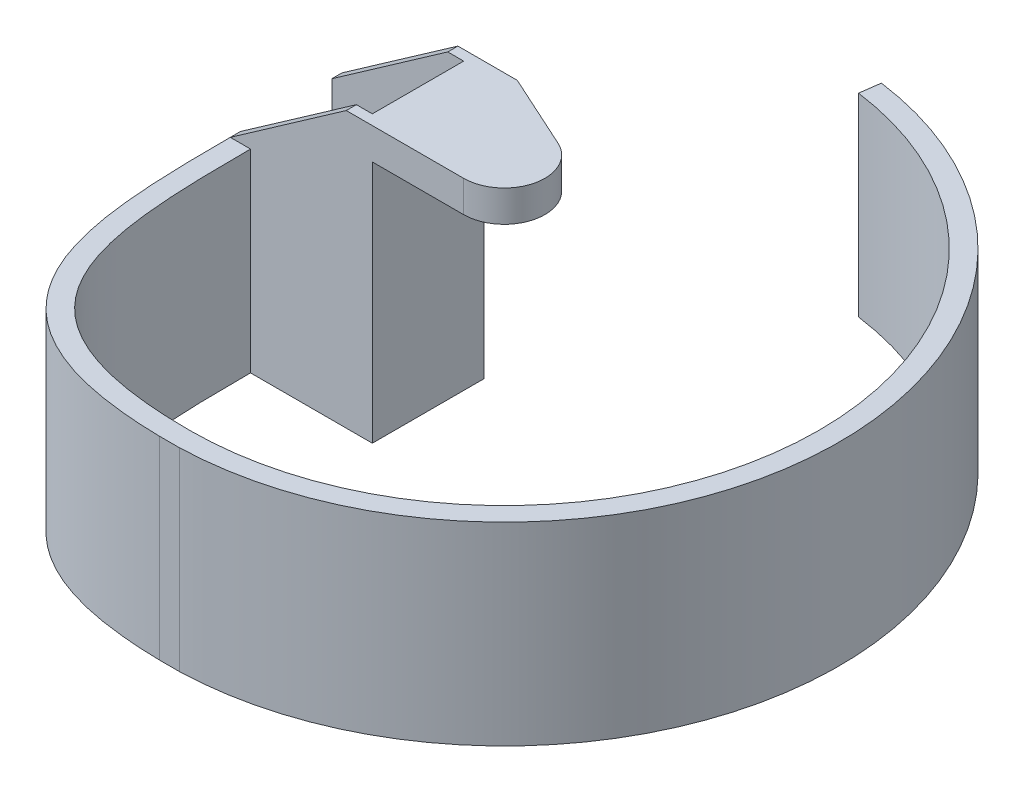
ISO-10303-21;
HEADER;
FILE_DESCRIPTION(('STEP AP214'),'2;1');
FILE_NAME('part.step','',(''),(''),'','','');
FILE_SCHEMA(('AUTOMOTIVE_DESIGN { 1 0 10303 214 1 1 1 1 }'));
ENDSEC;
DATA;
#1=APPLICATION_CONTEXT('core data for automotive mechanical design processes');
#2=APPLICATION_PROTOCOL_DEFINITION('international standard','automotive_design',2000,#1);
#3=PRODUCT_CONTEXT('',#1,'mechanical');
#4=PRODUCT('Part','Part','',(#3));
#5=PRODUCT_RELATED_PRODUCT_CATEGORY('part','',(#4));
#6=PRODUCT_DEFINITION_FORMATION('','',#4);
#7=PRODUCT_DEFINITION_CONTEXT('part definition',#1,'design');
#8=PRODUCT_DEFINITION('design','',#6,#7);
#9=PRODUCT_DEFINITION_SHAPE('','',#8);
#10=(LENGTH_UNIT() NAMED_UNIT(*) SI_UNIT(.MILLI.,.METRE.));
#11=(NAMED_UNIT(*) PLANE_ANGLE_UNIT() SI_UNIT($,.RADIAN.));
#12=(NAMED_UNIT(*) SI_UNIT($,.STERADIAN.) SOLID_ANGLE_UNIT());
#13=UNCERTAINTY_MEASURE_WITH_UNIT(LENGTH_MEASURE(1.E-05),#10,'distance_accuracy_value','');
#14=(GEOMETRIC_REPRESENTATION_CONTEXT(3) GLOBAL_UNCERTAINTY_ASSIGNED_CONTEXT((#13)) GLOBAL_UNIT_ASSIGNED_CONTEXT((#10,
#11,#12)) REPRESENTATION_CONTEXT('',''));
#15=CARTESIAN_POINT('',(0.,0.,0.));
#16=DIRECTION('',(0.,0.,1.));
#17=DIRECTION('',(1.,0.,0.));
#18=AXIS2_PLACEMENT_3D('',#15,#16,#17);
#19=CARTESIAN_POINT('',(-133.35,121.285,25.4));
#20=CARTESIAN_POINT('',(-133.35,121.285,131.233333333333));
#21=CARTESIAN_POINT('',(-127.000000000004,121.285,196.85));
#22=CARTESIAN_POINT('',(0.,121.285,196.85));
#23=B_SPLINE_CURVE_WITH_KNOTS('',3,(#19,#20,#21,#22),.UNSPECIFIED.,.F.,.F.,(4,4),(0.,1.),.UNSPECIFIED.);
#24=DIRECTION('',(0.,-1.,0.));
#25=VECTOR('',#24,1.);
#26=SURFACE_OF_LINEAR_EXTRUSION('',#23,#25);
#27=CARTESIAN_POINT('',(-133.35,0.,25.4));
#28=CARTESIAN_POINT('',(-133.35,0.,131.233333333333));
#29=CARTESIAN_POINT('',(-127.000000000004,0.,196.85));
#30=CARTESIAN_POINT('',(0.,0.,196.85));
#31=B_SPLINE_CURVE_WITH_KNOTS('',3,(#27,#28,#29,#30),.UNSPECIFIED.,.F.,.F.,(4,4),(0.,1.),.UNSPECIFIED.);
#32=CARTESIAN_POINT('',(-133.35,0.,25.4));
#33=VERTEX_POINT('',#32);
#34=CARTESIAN_POINT('',(0.,0.,196.85));
#35=VERTEX_POINT('',#34);
#36=EDGE_CURVE('E314',#33,#35,#31,.T.);
#37=ORIENTED_EDGE('',*,*,#36,.F.);
#38=DIRECTION('',(0.,-1.,0.));
#39=VECTOR('',#38,1.);
#40=CARTESIAN_POINT('',(-133.35,121.285,25.4));
#41=LINE('',#40,#39);
#42=CARTESIAN_POINT('',(-133.35,121.285,25.4));
#43=VERTEX_POINT('',#42);
#44=EDGE_CURVE('E52',#43,#33,#41,.T.);
#45=ORIENTED_EDGE('',*,*,#44,.F.);
#46=CARTESIAN_POINT('',(0.,121.285,196.85));
#47=VERTEX_POINT('',#46);
#48=EDGE_CURVE('E198',#43,#47,#23,.T.);
#49=ORIENTED_EDGE('',*,*,#48,.T.);
#50=DIRECTION('',(0.,-1.,0.));
#51=VECTOR('',#50,1.);
#52=CARTESIAN_POINT('',(0.,121.285,196.85));
#53=LINE('',#52,#51);
#54=EDGE_CURVE('E316',#47,#35,#53,.T.);
#55=ORIENTED_EDGE('',*,*,#54,.T.);
#56=EDGE_LOOP('',(#37,#45,#49,#55));
#57=FACE_BOUND('',#56,.T.);
#58=ADVANCED_FACE('F43',(#57),#26,.T.);
#59=CARTESIAN_POINT('',(-146.008404278864,121.285,12.741595721136));
#60=CARTESIAN_POINT('',(-146.008404278864,121.285,14.4342364692206));
#61=CARTESIAN_POINT('',(-146.008336547477,121.285,17.8077717619581));
#62=CARTESIAN_POINT('',(-146.008564139383,121.285,21.6027773371863));
#63=CARTESIAN_POINT('',(-146.008293238688,121.285,24.5474315018755));
#64=CARTESIAN_POINT('',(-146.008883870611,121.285,27.9687436822124));
#65=CARTESIAN_POINT('',(-145.992828985907,121.285,37.6758120791757));
#66=CARTESIAN_POINT('',(-145.847861716869,121.285,52.8132306916872));
#67=CARTESIAN_POINT('',(-145.252148771485,121.285,71.5712819286864));
#68=CARTESIAN_POINT('',(-144.048815033332,121.285,89.4193686386773));
#69=CARTESIAN_POINT('',(-142.031880926839,121.285,106.362231784065));
#70=CARTESIAN_POINT('',(-137.954990072308,121.285,127.728726744472));
#71=CARTESIAN_POINT('',(-131.289734266183,121.285,147.262243010393));
#72=CARTESIAN_POINT('',(-120.92863620716,121.285,164.576629863361));
#73=CARTESIAN_POINT('',(-111.101066217975,121.285,176.207339111434));
#74=CARTESIAN_POINT('',(-99.1375575259071,121.285,186.230706710612));
#75=CARTESIAN_POINT('',(-85.0632306803264,121.285,194.472251254184));
#76=CARTESIAN_POINT('',(-71.5910923653762,121.285,199.823977741644));
#77=CARTESIAN_POINT('',(-59.7326179444139,121.285,203.218129467848));
#78=CARTESIAN_POINT('',(-50.280608969257,121.285,205.327908470272));
#79=CARTESIAN_POINT('',(-40.2500714462276,121.285,207.008611147021));
#80=CARTESIAN_POINT('',(-31.3896524594036,121.285,208.056286946028));
#81=CARTESIAN_POINT('',(-23.9871472034043,121.285,208.684629614168));
#82=CARTESIAN_POINT('',(-18.2760240559845,121.285,209.051283620528));
#83=CARTESIAN_POINT('',(-13.3773718949414,121.285,209.269931642801));
#84=CARTESIAN_POINT('',(-9.38192810204939,121.285,209.392630986676));
#85=CARTESIAN_POINT('',(-7.34346977478592,121.285,209.436839099715));
#86=CARTESIAN_POINT('',(-6.32920213943207,121.285,209.454395275626));
#87=B_SPLINE_CURVE_WITH_KNOTS('',3,(#59,#60,#61,#62,#63,#64,#65,#66,#67,#68,#69,#70,#71,#72,#73,
#74,#75,#76,#77,#78,#79,#80,#81,#82,#83,#84,#85,#86),.UNSPECIFIED.,.F.,.F.,(4,1,1,1,1,1,1,1,1,1,
1,1,1,1,1,1,1,1,1,1,1,1,1,1,1,4),(-0.0398689898546898,-0.023875533967276,-0.0079967279437069,
-0.00399836397185345,0.00399836397185345,0.0241048336949654,0.0880786572446206,
0.152052480794276,0.216026304343931,0.280000127893586,0.343973951443241,0.471921598542552,
0.535895422092207,0.599869245641862,0.663843069191517,0.727816892741173,0.791790716290828,
0.823777628065655,0.855764539840483,0.887751451615311,0.919738363390138,0.935731819277552,
0.951725275164966,0.96771873105238,0.975715458996087,0.983712186939793),.UNSPECIFIED.);
#88=DIRECTION('',(0.,-1.,0.));
#89=VECTOR('',#88,1.);
#90=SURFACE_OF_LINEAR_EXTRUSION('',#87,#89);
#91=CARTESIAN_POINT('',(-146.008404278864,0.,12.741595721136));
#92=CARTESIAN_POINT('',(-146.008404278864,0.,14.4342364692206));
#93=CARTESIAN_POINT('',(-146.008336547477,0.,17.8077717619581));
#94=CARTESIAN_POINT('',(-146.008564139383,0.,21.6027773371863));
#95=CARTESIAN_POINT('',(-146.008293238688,0.,24.5474315018755));
#96=CARTESIAN_POINT('',(-146.008883870611,0.,27.9687436822124));
#97=CARTESIAN_POINT('',(-145.992828985907,0.,37.6758120791757));
#98=CARTESIAN_POINT('',(-145.847861716869,0.,52.8132306916872));
#99=CARTESIAN_POINT('',(-145.252148771485,0.,71.5712819286864));
#100=CARTESIAN_POINT('',(-144.048815033332,0.,89.4193686386773));
#101=CARTESIAN_POINT('',(-142.031880926839,0.,106.362231784065));
#102=CARTESIAN_POINT('',(-137.954990072308,0.,127.728726744472));
#103=CARTESIAN_POINT('',(-131.289734266183,0.,147.262243010393));
#104=CARTESIAN_POINT('',(-120.92863620716,0.,164.576629863361));
#105=CARTESIAN_POINT('',(-111.101066217975,0.,176.207339111434));
#106=CARTESIAN_POINT('',(-99.1375575259071,0.,186.230706710612));
#107=CARTESIAN_POINT('',(-85.0632306803264,0.,194.472251254184));
#108=CARTESIAN_POINT('',(-71.5910923653762,0.,199.823977741644));
#109=CARTESIAN_POINT('',(-59.7326179444139,0.,203.218129467848));
#110=CARTESIAN_POINT('',(-50.280608969257,0.,205.327908470272));
#111=CARTESIAN_POINT('',(-40.2500714462276,0.,207.008611147021));
#112=CARTESIAN_POINT('',(-31.3896524594036,0.,208.056286946028));
#113=CARTESIAN_POINT('',(-23.9871472034043,0.,208.684629614168));
#114=CARTESIAN_POINT('',(-18.2760240559845,0.,209.051283620528));
#115=CARTESIAN_POINT('',(-13.3773718949414,0.,209.269931642801));
#116=CARTESIAN_POINT('',(-9.38192810204939,0.,209.392630986676));
#117=CARTESIAN_POINT('',(-7.34346977478592,0.,209.436839099715));
#118=CARTESIAN_POINT('',(-6.32920213943207,0.,209.454395275626));
#119=B_SPLINE_CURVE_WITH_KNOTS('',3,(#91,#92,#93,#94,#95,#96,#97,#98,#99,#100,#101,#102,#103,
#104,#105,#106,#107,#108,#109,#110,#111,#112,#113,#114,#115,#116,#117,#118),.UNSPECIFIED.,.F.,
.F.,(4,1,1,1,1,1,1,1,1,1,1,1,1,1,1,1,1,1,1,1,1,1,1,1,1,4),(-0.0398689898546898,
-0.023875533967276,-0.0079967279437069,-0.00399836397185345,0.00399836397185345,
0.0241048336949654,0.0880786572446206,0.152052480794276,0.216026304343931,0.280000127893586,
0.343973951443241,0.471921598542552,0.535895422092207,0.599869245641862,0.663843069191517,
0.727816892741173,0.791790716290828,0.823777628065655,0.855764539840483,0.887751451615311,
0.919738363390138,0.935731819277552,0.951725275164966,0.96771873105238,0.975715458996087,
0.983712186939793),.UNSPECIFIED.);
#120=CARTESIAN_POINT('',(-146.008404278864,0.,25.4));
#121=VERTEX_POINT('',#120);
#122=CARTESIAN_POINT('',(-6.32920213943279,0.,209.454395275626));
#123=VERTEX_POINT('',#122);
#124=EDGE_CURVE('E319',#121,#123,#119,.T.);
#125=ORIENTED_EDGE('',*,*,#124,.T.);
#126=DIRECTION('',(0.,-1.,0.));
#127=VECTOR('',#126,1.);
#128=CARTESIAN_POINT('',(-6.32920213943279,121.285,209.454395275626));
#129=LINE('',#128,#127);
#130=CARTESIAN_POINT('',(-6.32920213943279,121.285,209.454395275626));
#131=VERTEX_POINT('',#130);
#132=EDGE_CURVE('E206',#131,#123,#129,.T.);
#133=ORIENTED_EDGE('',*,*,#132,.F.);
#134=CARTESIAN_POINT('',(-146.008404278864,121.285,25.4));
#135=VERTEX_POINT('',#134);
#136=EDGE_CURVE('E195',#135,#131,#87,.T.);
#137=ORIENTED_EDGE('',*,*,#136,.F.);
#138=DIRECTION('',(0.,-1.,0.));
#139=VECTOR('',#138,1.);
#140=CARTESIAN_POINT('',(-146.008404278864,121.285,25.4));
#141=LINE('',#140,#139);
#142=EDGE_CURVE('E203',#135,#121,#141,.T.);
#143=ORIENTED_EDGE('',*,*,#142,.T.);
#144=EDGE_LOOP('',(#125,#133,#137,#143));
#145=FACE_BOUND('',#144,.T.);
#146=ADVANCED_FACE('F202',(#145),#90,.F.);
#147=CARTESIAN_POINT('',(9.18524511941114E-13,121.285,209.454395275626));
#148=DIRECTION('',(0.,0.,-1.));
#149=DIRECTION('',(-1.,0.,0.));
#150=AXIS2_PLACEMENT_3D('',#147,#148,#149);
#151=PLANE('',#150);
#152=DIRECTION('',(1.,0.,0.));
#153=VECTOR('',#152,1.);
#154=CARTESIAN_POINT('',(9.18524511941114E-13,0.,209.454395275626));
#155=LINE('',#154,#153);
#156=CARTESIAN_POINT('',(6.32920213943129,0.,209.454395275626));
#157=VERTEX_POINT('',#156);
#158=EDGE_CURVE('E362',#123,#157,#155,.T.);
#159=ORIENTED_EDGE('',*,*,#158,.T.);
#160=DIRECTION('',(0.,-1.,0.));
#161=VECTOR('',#160,1.);
#162=CARTESIAN_POINT('',(6.32920213943129,121.285,209.454395275626));
#163=LINE('',#162,#161);
#164=CARTESIAN_POINT('',(6.32920213943129,121.285,209.454395275626));
#165=VERTEX_POINT('',#164);
#166=EDGE_CURVE('E215',#165,#157,#163,.T.);
#167=ORIENTED_EDGE('',*,*,#166,.F.);
#168=DIRECTION('',(1.,0.,0.));
#169=VECTOR('',#168,1.);
#170=CARTESIAN_POINT('',(9.18524511941114E-13,121.285,209.454395275626));
#171=LINE('',#170,#169);
#172=EDGE_CURVE('E208',#131,#165,#171,.T.);
#173=ORIENTED_EDGE('',*,*,#172,.F.);
#174=ORIENTED_EDGE('',*,*,#132,.T.);
#175=EDGE_LOOP('',(#159,#167,#173,#174));
#176=FACE_BOUND('',#175,.T.);
#177=ADVANCED_FACE('F237',(#176),#151,.F.);
#178=CARTESIAN_POINT('',(0.,121.285,0.));
#179=DIRECTION('',(0.,-1.,0.));
#180=DIRECTION('',(0.,0.,-1.));
#181=AXIS2_PLACEMENT_3D('',#178,#179,#180);
#182=CYLINDRICAL_SURFACE('',#181,209.55);
#183=CARTESIAN_POINT('',(0.,0.,0.));
#184=DIRECTION('',(0.,1.,0.));
#185=DIRECTION('',(0.,0.,1.));
#186=AXIS2_PLACEMENT_3D('',#183,#184,#185);
#187=CIRCLE('',#186,209.55);
#188=CARTESIAN_POINT('',(28.2664280831572,0.,-207.634803304792));
#189=VERTEX_POINT('',#188);
#190=EDGE_CURVE('E364',#189,#157,#187,.F.);
#191=ORIENTED_EDGE('',*,*,#190,.F.);
#192=DIRECTION('',(0.,-1.,0.));
#193=VECTOR('',#192,1.);
#194=CARTESIAN_POINT('',(28.2664280831572,121.285,-207.634803304792));
#195=LINE('',#194,#193);
#196=CARTESIAN_POINT('',(28.2664280831572,121.285,-207.634803304792));
#197=VERTEX_POINT('',#196);
#198=EDGE_CURVE('E385',#197,#189,#195,.T.);
#199=ORIENTED_EDGE('',*,*,#198,.F.);
#200=CARTESIAN_POINT('',(0.,121.285,0.));
#201=DIRECTION('',(0.,1.,0.));
#202=DIRECTION('',(0.,0.,1.));
#203=AXIS2_PLACEMENT_3D('',#200,#201,#202);
#204=CIRCLE('',#203,209.55);
#205=EDGE_CURVE('E391',#197,#165,#204,.F.);
#206=ORIENTED_EDGE('',*,*,#205,.T.);
#207=ORIENTED_EDGE('',*,*,#166,.T.);
#208=EDGE_LOOP('',(#191,#199,#206,#207));
#209=FACE_BOUND('',#208,.T.);
#210=ADVANCED_FACE('F240',(#209),#182,.T.);
#211=CARTESIAN_POINT('',(-1.27883842512838E-12,121.285,-1.74095064018762E-13));
#212=DIRECTION('',(-0.990860430946275,0.,-0.134891090828721));
#213=DIRECTION('',(-0.134891090828721,0.,0.990860430946275));
#214=AXIS2_PLACEMENT_3D('',#211,#212,#213);
#215=PLANE('',#214);
#216=DIRECTION('',(0.134891090828721,0.,-0.990860430946275));
#217=VECTOR('',#216,1.);
#218=CARTESIAN_POINT('',(-1.27883842512838E-12,0.,-1.74095064018762E-13));
#219=LINE('',#218,#217);
#220=CARTESIAN_POINT('',(26.5533112296325,0.,-195.050875831774));
#221=VERTEX_POINT('',#220);
#222=EDGE_CURVE('E376',#221,#189,#219,.T.);
#223=ORIENTED_EDGE('',*,*,#222,.F.);
#224=DIRECTION('',(0.,-1.,0.));
#225=VECTOR('',#224,1.);
#226=CARTESIAN_POINT('',(26.5533112296325,121.285,-195.050875831774));
#227=LINE('',#226,#225);
#228=CARTESIAN_POINT('',(26.5533112296325,121.285,-195.050875831774));
#229=VERTEX_POINT('',#228);
#230=EDGE_CURVE('E382',#229,#221,#227,.T.);
#231=ORIENTED_EDGE('',*,*,#230,.F.);
#232=DIRECTION('',(0.134891090828721,0.,-0.990860430946275));
#233=VECTOR('',#232,1.);
#234=CARTESIAN_POINT('',(-1.27883842512838E-12,121.285,-1.74095064018762E-13));
#235=LINE('',#234,#233);
#236=EDGE_CURVE('E396',#229,#197,#235,.T.);
#237=ORIENTED_EDGE('',*,*,#236,.T.);
#238=ORIENTED_EDGE('',*,*,#198,.T.);
#239=EDGE_LOOP('',(#223,#231,#237,#238));
#240=FACE_BOUND('',#239,.T.);
#241=ADVANCED_FACE('F244',(#240),#215,.T.);
#242=CARTESIAN_POINT('',(0.,121.285,0.));
#243=DIRECTION('',(0.,-1.,0.));
#244=DIRECTION('',(0.,0.,-1.));
#245=AXIS2_PLACEMENT_3D('',#242,#243,#244);
#246=CYLINDRICAL_SURFACE('',#245,196.85);
#247=CARTESIAN_POINT('',(0.,0.,0.));
#248=DIRECTION('',(0.,1.,0.));
#249=DIRECTION('',(0.,0.,1.));
#250=AXIS2_PLACEMENT_3D('',#247,#248,#249);
#251=CIRCLE('',#250,196.85);
#252=EDGE_CURVE('E379',#221,#35,#251,.F.);
#253=ORIENTED_EDGE('',*,*,#252,.T.);
#254=ORIENTED_EDGE('',*,*,#54,.F.);
#255=CARTESIAN_POINT('',(0.,121.285,0.));
#256=DIRECTION('',(0.,1.,0.));
#257=DIRECTION('',(0.,0.,1.));
#258=AXIS2_PLACEMENT_3D('',#255,#256,#257);
#259=CIRCLE('',#258,196.85);
#260=EDGE_CURVE('E383',#229,#47,#259,.F.);
#261=ORIENTED_EDGE('',*,*,#260,.F.);
#262=ORIENTED_EDGE('',*,*,#230,.T.);
#263=EDGE_LOOP('',(#253,#254,#261,#262));
#264=FACE_BOUND('',#263,.T.);
#265=ADVANCED_FACE('F248',(#264),#246,.F.);
#266=CARTESIAN_POINT('',(0.,121.285,0.));
#267=DIRECTION('',(0.,1.,0.));
#268=DIRECTION('',(0.,0.,1.));
#269=AXIS2_PLACEMENT_3D('',#266,#267,#268);
#270=PLANE('',#269);
#271=ORIENTED_EDGE('',*,*,#48,.F.);
#272=DIRECTION('',(-1.,0.,0.));
#273=VECTOR('',#272,1.);
#274=CARTESIAN_POINT('',(0.,121.285,25.4));
#275=LINE('',#274,#273);
#276=EDGE_CURVE('E188',#43,#135,#275,.T.);
#277=ORIENTED_EDGE('',*,*,#276,.T.);
#278=ORIENTED_EDGE('',*,*,#136,.T.);
#279=ORIENTED_EDGE('',*,*,#172,.T.);
#280=ORIENTED_EDGE('',*,*,#205,.F.);
#281=ORIENTED_EDGE('',*,*,#236,.F.);
#282=ORIENTED_EDGE('',*,*,#260,.T.);
#283=EDGE_LOOP('',(#271,#277,#278,#279,#280,#281,#282));
#284=FACE_BOUND('',#283,.T.);
#285=ADVANCED_FACE('F194',(#284),#270,.T.);
#286=CARTESIAN_POINT('',(0.,0.,0.));
#287=DIRECTION('',(0.,1.,0.));
#288=DIRECTION('',(0.,0.,1.));
#289=AXIS2_PLACEMENT_3D('',#286,#287,#288);
#290=PLANE('',#289);
#291=DIRECTION('',(-1.,0.,0.));
#292=VECTOR('',#291,1.);
#293=CARTESIAN_POINT('',(0.,0.,-44.45));
#294=LINE('',#293,#292);
#295=CARTESIAN_POINT('',(-57.15,0.,-44.45));
#296=VERTEX_POINT('',#295);
#297=CARTESIAN_POINT('',(-146.008404278864,0.,-44.45));
#298=VERTEX_POINT('',#297);
#299=EDGE_CURVE('E336',#296,#298,#294,.T.);
#300=ORIENTED_EDGE('',*,*,#299,.F.);
#301=DIRECTION('',(0.,0.,1.));
#302=VECTOR('',#301,1.);
#303=CARTESIAN_POINT('',(-57.15,0.,-207.635803304792));
#304=LINE('',#303,#302);
#305=CARTESIAN_POINT('',(-57.15,0.,25.4));
#306=VERTEX_POINT('',#305);
#307=EDGE_CURVE('E401',#296,#306,#304,.T.);
#308=ORIENTED_EDGE('',*,*,#307,.T.);
#309=DIRECTION('',(-1.,0.,0.));
#310=VECTOR('',#309,1.);
#311=CARTESIAN_POINT('',(0.,0.,25.4));
#312=LINE('',#311,#310);
#313=EDGE_CURVE('E323',#306,#33,#312,.T.);
#314=ORIENTED_EDGE('',*,*,#313,.T.);
#315=ORIENTED_EDGE('',*,*,#36,.T.);
#316=ORIENTED_EDGE('',*,*,#252,.F.);
#317=ORIENTED_EDGE('',*,*,#222,.T.);
#318=ORIENTED_EDGE('',*,*,#190,.T.);
#319=ORIENTED_EDGE('',*,*,#158,.F.);
#320=ORIENTED_EDGE('',*,*,#124,.F.);
#321=DIRECTION('',(0.,0.,-1.));
#322=VECTOR('',#321,1.);
#323=CARTESIAN_POINT('',(-146.008404278864,0.,1.16035713829043E-13));
#324=LINE('',#323,#322);
#325=EDGE_CURVE('E212',#121,#298,#324,.T.);
#326=ORIENTED_EDGE('',*,*,#325,.T.);
#327=EDGE_LOOP('',(#300,#308,#314,#315,#316,#317,#318,#319,#320,#326));
#328=FACE_BOUND('',#327,.T.);
#329=ADVANCED_FACE('F253',(#328),#290,.F.);
#330=CARTESIAN_POINT('',(0.,172.085,0.));
#331=DIRECTION('',(0.,1.,0.));
#332=DIRECTION('',(0.,0.,1.));
#333=AXIS2_PLACEMENT_3D('',#330,#331,#332);
#334=PLANE('',#333);
#335=DIRECTION('',(0.,0.,1.));
#336=VECTOR('',#335,1.);
#337=CARTESIAN_POINT('',(-73.4584855363638,172.085,-207.634803304792));
#338=LINE('',#337,#336);
#339=CARTESIAN_POINT('',(-73.4584855363638,172.085,19.05));
#340=VERTEX_POINT('',#339);
#341=CARTESIAN_POINT('',(-73.4584855363638,172.085,25.4));
#342=VERTEX_POINT('',#341);
#343=EDGE_CURVE('E68',#340,#342,#338,.T.);
#344=ORIENTED_EDGE('',*,*,#343,.T.);
#345=DIRECTION('',(-1.,0.,0.));
#346=VECTOR('',#345,1.);
#347=CARTESIAN_POINT('',(0.,172.085,25.4));
#348=LINE('',#347,#346);
#349=CARTESIAN_POINT('',(0.,172.085,25.4));
#350=VERTEX_POINT('',#349);
#351=EDGE_CURVE('E190',#350,#342,#348,.T.);
#352=ORIENTED_EDGE('',*,*,#351,.F.);
#353=CARTESIAN_POINT('',(0.,172.085,0.));
#354=DIRECTION('',(0.,1.,0.));
#355=DIRECTION('',(0.,0.,1.));
#356=AXIS2_PLACEMENT_3D('',#353,#354,#355);
#357=CIRCLE('',#356,25.4);
#358=CARTESIAN_POINT('',(10.5332083634683,172.085,-23.1130162802643));
#359=VERTEX_POINT('',#358);
#360=EDGE_CURVE('E332',#350,#359,#357,.T.);
#361=ORIENTED_EDGE('',*,*,#360,.T.);
#362=DIRECTION('',(0.909961270876546,0.,0.414693242656233));
#363=VECTOR('',#362,1.);
#364=CARTESIAN_POINT('',(10.5332083634683,172.085,-23.1130162802643));
#365=LINE('',#364,#363);
#366=CARTESIAN_POINT('',(-36.2865292766214,172.085,-44.45));
#367=VERTEX_POINT('',#366);
#368=EDGE_CURVE('E341',#367,#359,#365,.T.);
#369=ORIENTED_EDGE('',*,*,#368,.F.);
#370=DIRECTION('',(-1.,0.,0.));
#371=VECTOR('',#370,1.);
#372=CARTESIAN_POINT('',(0.,172.085,-44.45));
#373=LINE('',#372,#371);
#374=CARTESIAN_POINT('',(-73.4584855363638,172.085,-44.45));
#375=VERTEX_POINT('',#374);
#376=EDGE_CURVE('E327',#367,#375,#373,.T.);
#377=ORIENTED_EDGE('',*,*,#376,.T.);
#378=CARTESIAN_POINT('',(-73.4584855363638,172.085,-38.1));
#379=VERTEX_POINT('',#378);
#380=EDGE_CURVE('E420',#375,#379,#338,.T.);
#381=ORIENTED_EDGE('',*,*,#380,.T.);
#382=DIRECTION('',(-1.,0.,0.));
#383=VECTOR('',#382,1.);
#384=CARTESIAN_POINT('',(-63.5,172.085,-38.1));
#385=LINE('',#384,#383);
#386=CARTESIAN_POINT('',(-63.5,172.085,-38.1));
#387=VERTEX_POINT('',#386);
#388=EDGE_CURVE('E447',#387,#379,#385,.T.);
#389=ORIENTED_EDGE('',*,*,#388,.F.);
#390=DIRECTION('',(0.,0.,-1.));
#391=VECTOR('',#390,1.);
#392=CARTESIAN_POINT('',(-63.5,172.085,-38.1));
#393=LINE('',#392,#391);
#394=CARTESIAN_POINT('',(-63.5,172.085,19.05));
#395=VERTEX_POINT('',#394);
#396=EDGE_CURVE('E435',#395,#387,#393,.T.);
#397=ORIENTED_EDGE('',*,*,#396,.F.);
#398=DIRECTION('',(1.,0.,0.));
#399=VECTOR('',#398,1.);
#400=CARTESIAN_POINT('',(-146.008404278864,172.085,19.05));
#401=LINE('',#400,#399);
#402=EDGE_CURVE('E445',#340,#395,#401,.T.);
#403=ORIENTED_EDGE('',*,*,#402,.F.);
#404=EDGE_LOOP('',(#344,#352,#361,#369,#377,#381,#389,#397,#403));
#405=FACE_BOUND('',#404,.T.);
#406=ADVANCED_FACE('F256',(#405),#334,.T.);
#407=CARTESIAN_POINT('',(-146.008404278864,407.979201847131,1.16035713829043E-13));
#408=DIRECTION('',(-1.,0.,0.));
#409=DIRECTION('',(0.,0.,1.));
#410=AXIS2_PLACEMENT_3D('',#407,#408,#409);
#411=PLANE('',#410);
#412=DIRECTION('',(0.,0.,1.));
#413=VECTOR('',#412,1.);
#414=CARTESIAN_POINT('',(-146.008404278864,121.285,-207.634803304792));
#415=LINE('',#414,#413);
#416=CARTESIAN_POINT('',(-146.008404278864,121.285,-44.45));
#417=VERTEX_POINT('',#416);
#418=CARTESIAN_POINT('',(-146.008404278864,121.285,-38.1));
#419=VERTEX_POINT('',#418);
#420=EDGE_CURVE('E60',#417,#419,#415,.T.);
#421=ORIENTED_EDGE('',*,*,#420,.F.);
#422=DIRECTION('',(0.,-1.,0.));
#423=VECTOR('',#422,1.);
#424=CARTESIAN_POINT('',(-146.008404278864,407.979201847131,-44.45));
#425=LINE('',#424,#423);
#426=EDGE_CURVE('E329',#417,#298,#425,.T.);
#427=ORIENTED_EDGE('',*,*,#426,.T.);
#428=ORIENTED_EDGE('',*,*,#325,.F.);
#429=ORIENTED_EDGE('',*,*,#142,.F.);
#430=CARTESIAN_POINT('',(-146.008404278864,121.285,19.05));
#431=VERTEX_POINT('',#430);
#432=EDGE_CURVE('E173',#431,#135,#415,.T.);
#433=ORIENTED_EDGE('',*,*,#432,.F.);
#434=DIRECTION('',(0.,1.,0.));
#435=VECTOR('',#434,1.);
#436=CARTESIAN_POINT('',(-146.008404278864,-100.368118825872,19.05));
#437=LINE('',#436,#435);
#438=CARTESIAN_POINT('',(-146.008404278864,50.8,19.05));
#439=VERTEX_POINT('',#438);
#440=EDGE_CURVE('E434',#439,#431,#437,.T.);
#441=ORIENTED_EDGE('',*,*,#440,.F.);
#442=DIRECTION('',(0.,0.,-1.));
#443=VECTOR('',#442,1.);
#444=CARTESIAN_POINT('',(-146.008404278864,50.8,-38.1));
#445=LINE('',#444,#443);
#446=CARTESIAN_POINT('',(-146.008404278864,50.8,-38.1));
#447=VERTEX_POINT('',#446);
#448=EDGE_CURVE('E424',#439,#447,#445,.T.);
#449=ORIENTED_EDGE('',*,*,#448,.T.);
#450=DIRECTION('',(0.,1.,0.));
#451=VECTOR('',#450,1.);
#452=CARTESIAN_POINT('',(-146.008404278864,-100.368118825872,-38.1));
#453=LINE('',#452,#451);
#454=EDGE_CURVE('E432',#447,#419,#453,.T.);
#455=ORIENTED_EDGE('',*,*,#454,.T.);
#456=EDGE_LOOP('',(#421,#427,#428,#429,#433,#441,#449,#455));
#457=FACE_BOUND('',#456,.T.);
#458=ADVANCED_FACE('F210',(#457),#411,.T.);
#459=CARTESIAN_POINT('',(0.,407.979201847131,-44.45));
#460=DIRECTION('',(0.,0.,1.));
#461=DIRECTION('',(1.,0.,0.));
#462=AXIS2_PLACEMENT_3D('',#459,#460,#461);
#463=PLANE('',#462);
#464=ORIENTED_EDGE('',*,*,#426,.F.);
#465=DIRECTION('',(0.819152044288995,0.573576436351042,0.));
#466=VECTOR('',#465,1.);
#467=CARTESIAN_POINT('',(86.6669184886002,284.206014957154,-44.45));
#468=LINE('',#467,#466);
#469=EDGE_CURVE('E417',#417,#375,#468,.T.);
#470=ORIENTED_EDGE('',*,*,#469,.T.);
#471=ORIENTED_EDGE('',*,*,#376,.F.);
#472=DIRECTION('',(0.,-1.,0.));
#473=VECTOR('',#472,1.);
#474=CARTESIAN_POINT('',(-36.2865292766214,407.979201847131,-44.45));
#475=LINE('',#474,#473);
#476=CARTESIAN_POINT('',(-36.2865292766214,152.4,-44.45));
#477=VERTEX_POINT('',#476);
#478=EDGE_CURVE('E349',#367,#477,#475,.T.);
#479=ORIENTED_EDGE('',*,*,#478,.T.);
#480=DIRECTION('',(1.,0.,0.));
#481=VECTOR('',#480,1.);
#482=CARTESIAN_POINT('',(25.4,152.4,-44.45));
#483=LINE('',#482,#481);
#484=CARTESIAN_POINT('',(-57.15,152.4,-44.45));
#485=VERTEX_POINT('',#484);
#486=EDGE_CURVE('E340',#485,#477,#483,.T.);
#487=ORIENTED_EDGE('',*,*,#486,.F.);
#488=DIRECTION('',(0.,1.,0.));
#489=VECTOR('',#488,1.);
#490=CARTESIAN_POINT('',(-57.15,0.,-44.45));
#491=LINE('',#490,#489);
#492=EDGE_CURVE('E358',#296,#485,#491,.T.);
#493=ORIENTED_EDGE('',*,*,#492,.F.);
#494=ORIENTED_EDGE('',*,*,#299,.T.);
#495=EDGE_LOOP('',(#464,#470,#471,#479,#487,#493,#494));
#496=FACE_BOUND('',#495,.T.);
#497=ADVANCED_FACE('F265',(#496),#463,.F.);
#498=CARTESIAN_POINT('',(10.5332083634683,407.979201847131,-23.1130162802643));
#499=DIRECTION('',(0.414693242656233,0.,-0.909961270876546));
#500=DIRECTION('',(-0.909961270876546,0.,-0.414693242656233));
#501=AXIS2_PLACEMENT_3D('',#498,#499,#500);
#502=PLANE('',#501);
#503=DIRECTION('',(-0.909961270876546,0.,-0.414693242656233));
#504=VECTOR('',#503,1.);
#505=CARTESIAN_POINT('',(-46.7872069440401,152.4,-49.2354345139273));
#506=LINE('',#505,#504);
#507=CARTESIAN_POINT('',(10.5332083634683,152.4,-23.1130162802643));
#508=VERTEX_POINT('',#507);
#509=EDGE_CURVE('E402',#508,#477,#506,.T.);
#510=ORIENTED_EDGE('',*,*,#509,.T.);
#511=ORIENTED_EDGE('',*,*,#478,.F.);
#512=ORIENTED_EDGE('',*,*,#368,.T.);
#513=DIRECTION('',(0.,-1.,0.));
#514=VECTOR('',#513,1.);
#515=CARTESIAN_POINT('',(10.5332083634683,407.979201847131,-23.1130162802643));
#516=LINE('',#515,#514);
#517=EDGE_CURVE('E343',#359,#508,#516,.T.);
#518=ORIENTED_EDGE('',*,*,#517,.T.);
#519=EDGE_LOOP('',(#510,#511,#512,#518));
#520=FACE_BOUND('',#519,.T.);
#521=ADVANCED_FACE('F268',(#520),#502,.T.);
#522=CARTESIAN_POINT('',(0.,407.979201847131,0.));
#523=DIRECTION('',(0.,-1.,0.));
#524=DIRECTION('',(0.,0.,-1.));
#525=AXIS2_PLACEMENT_3D('',#522,#523,#524);
#526=CYLINDRICAL_SURFACE('',#525,25.4);
#527=DIRECTION('',(0.,-1.,0.));
#528=VECTOR('',#527,1.);
#529=CARTESIAN_POINT('',(0.,407.979201847131,25.4));
#530=LINE('',#529,#528);
#531=CARTESIAN_POINT('',(0.,152.4,25.4));
#532=VERTEX_POINT('',#531);
#533=EDGE_CURVE('E338',#350,#532,#530,.T.);
#534=ORIENTED_EDGE('',*,*,#533,.T.);
#535=CARTESIAN_POINT('',(0.,152.4,0.));
#536=DIRECTION('',(0.,1.,0.));
#537=DIRECTION('',(0.,0.,1.));
#538=AXIS2_PLACEMENT_3D('',#535,#536,#537);
#539=CIRCLE('',#538,25.4);
#540=EDGE_CURVE('E423',#508,#532,#539,.F.);
#541=ORIENTED_EDGE('',*,*,#540,.F.);
#542=ORIENTED_EDGE('',*,*,#517,.F.);
#543=ORIENTED_EDGE('',*,*,#360,.F.);
#544=EDGE_LOOP('',(#534,#541,#542,#543));
#545=FACE_BOUND('',#544,.T.);
#546=ADVANCED_FACE('F272',(#545),#526,.T.);
#547=CARTESIAN_POINT('',(0.,407.979201847131,25.4));
#548=DIRECTION('',(0.,0.,1.));
#549=DIRECTION('',(1.,0.,0.));
#550=AXIS2_PLACEMENT_3D('',#547,#548,#549);
#551=PLANE('',#550);
#552=DIRECTION('',(0.819152044288995,0.573576436351042,0.));
#553=VECTOR('',#552,1.);
#554=CARTESIAN_POINT('',(-146.008404278864,121.285,25.4));
#555=LINE('',#554,#553);
#556=EDGE_CURVE('E176',#135,#342,#555,.T.);
#557=ORIENTED_EDGE('',*,*,#556,.F.);
#558=ORIENTED_EDGE('',*,*,#276,.F.);
#559=ORIENTED_EDGE('',*,*,#44,.T.);
#560=ORIENTED_EDGE('',*,*,#313,.F.);
#561=DIRECTION('',(0.,-1.,0.));
#562=VECTOR('',#561,1.);
#563=CARTESIAN_POINT('',(-57.15,0.,25.4));
#564=LINE('',#563,#562);
#565=CARTESIAN_POINT('',(-57.15,152.4,25.4));
#566=VERTEX_POINT('',#565);
#567=EDGE_CURVE('E325',#566,#306,#564,.T.);
#568=ORIENTED_EDGE('',*,*,#567,.F.);
#569=DIRECTION('',(-1.,0.,0.));
#570=VECTOR('',#569,1.);
#571=CARTESIAN_POINT('',(25.4,152.4,25.4));
#572=LINE('',#571,#570);
#573=EDGE_CURVE('E426',#532,#566,#572,.T.);
#574=ORIENTED_EDGE('',*,*,#573,.F.);
#575=ORIENTED_EDGE('',*,*,#533,.F.);
#576=ORIENTED_EDGE('',*,*,#351,.T.);
#577=EDGE_LOOP('',(#557,#558,#559,#560,#568,#574,#575,#576));
#578=FACE_BOUND('',#577,.T.);
#579=ADVANCED_FACE('F186',(#578),#551,.T.);
#580=CARTESIAN_POINT('',(-57.15,0.,-207.635803304792));
#581=DIRECTION('',(-1.,0.,0.));
#582=DIRECTION('',(0.,0.,1.));
#583=AXIS2_PLACEMENT_3D('',#580,#581,#582);
#584=PLANE('',#583);
#585=ORIENTED_EDGE('',*,*,#492,.T.);
#586=DIRECTION('',(0.,0.,1.));
#587=VECTOR('',#586,1.);
#588=CARTESIAN_POINT('',(-57.15,152.4,-207.635803304792));
#589=LINE('',#588,#587);
#590=EDGE_CURVE('E403',#485,#566,#589,.T.);
#591=ORIENTED_EDGE('',*,*,#590,.T.);
#592=ORIENTED_EDGE('',*,*,#567,.T.);
#593=ORIENTED_EDGE('',*,*,#307,.F.);
#594=EDGE_LOOP('',(#585,#591,#592,#593));
#595=FACE_BOUND('',#594,.T.);
#596=ADVANCED_FACE('F279',(#595),#584,.F.);
#597=CARTESIAN_POINT('',(25.4,152.4,-207.635803304792));
#598=DIRECTION('',(0.,1.,0.));
#599=DIRECTION('',(0.,0.,1.));
#600=AXIS2_PLACEMENT_3D('',#597,#598,#599);
#601=PLANE('',#600);
#602=ORIENTED_EDGE('',*,*,#486,.T.);
#603=ORIENTED_EDGE('',*,*,#509,.F.);
#604=ORIENTED_EDGE('',*,*,#540,.T.);
#605=ORIENTED_EDGE('',*,*,#573,.T.);
#606=ORIENTED_EDGE('',*,*,#590,.F.);
#607=EDGE_LOOP('',(#602,#603,#604,#605,#606));
#608=FACE_BOUND('',#607,.T.);
#609=ADVANCED_FACE('F280',(#608),#601,.F.);
#610=CARTESIAN_POINT('',(-63.5,-100.368118825872,-38.1));
#611=DIRECTION('',(0.,0.,-1.));
#612=DIRECTION('',(-1.,0.,0.));
#613=AXIS2_PLACEMENT_3D('',#610,#611,#612);
#614=PLANE('',#613);
#615=ORIENTED_EDGE('',*,*,#388,.T.);
#616=DIRECTION('',(-0.819152044288995,-0.573576436351042,0.));
#617=VECTOR('',#616,1.);
#618=CARTESIAN_POINT('',(-194.787334078344,87.1296256486024,-38.1));
#619=LINE('',#618,#617);
#620=EDGE_CURVE('E454',#379,#419,#619,.T.);
#621=ORIENTED_EDGE('',*,*,#620,.T.);
#622=ORIENTED_EDGE('',*,*,#454,.F.);
#623=DIRECTION('',(1.,0.,0.));
#624=VECTOR('',#623,1.);
#625=CARTESIAN_POINT('',(-63.5,50.8,-38.1));
#626=LINE('',#625,#624);
#627=CARTESIAN_POINT('',(-63.5,50.8,-38.1));
#628=VERTEX_POINT('',#627);
#629=EDGE_CURVE('E429',#447,#628,#626,.T.);
#630=ORIENTED_EDGE('',*,*,#629,.T.);
#631=DIRECTION('',(0.,1.,0.));
#632=VECTOR('',#631,1.);
#633=CARTESIAN_POINT('',(-63.5,-100.368118825872,-38.1));
#634=LINE('',#633,#632);
#635=EDGE_CURVE('E440',#628,#387,#634,.T.);
#636=ORIENTED_EDGE('',*,*,#635,.T.);
#637=EDGE_LOOP('',(#615,#621,#622,#630,#636));
#638=FACE_BOUND('',#637,.T.);
#639=ADVANCED_FACE('F283',(#638),#614,.F.);
#640=CARTESIAN_POINT('',(-63.5,-100.368118825872,-38.1));
#641=DIRECTION('',(1.,0.,0.));
#642=DIRECTION('',(0.,0.,-1.));
#643=AXIS2_PLACEMENT_3D('',#640,#641,#642);
#644=PLANE('',#643);
#645=DIRECTION('',(0.,0.,1.));
#646=VECTOR('',#645,1.);
#647=CARTESIAN_POINT('',(-63.5,50.8,-38.1));
#648=LINE('',#647,#646);
#649=CARTESIAN_POINT('',(-63.5,50.8,19.05));
#650=VERTEX_POINT('',#649);
#651=EDGE_CURVE('E450',#628,#650,#648,.T.);
#652=ORIENTED_EDGE('',*,*,#651,.T.);
#653=DIRECTION('',(0.,1.,0.));
#654=VECTOR('',#653,1.);
#655=CARTESIAN_POINT('',(-63.5,-100.368118825872,19.05));
#656=LINE('',#655,#654);
#657=EDGE_CURVE('E437',#650,#395,#656,.T.);
#658=ORIENTED_EDGE('',*,*,#657,.T.);
#659=ORIENTED_EDGE('',*,*,#396,.T.);
#660=ORIENTED_EDGE('',*,*,#635,.F.);
#661=EDGE_LOOP('',(#652,#658,#659,#660));
#662=FACE_BOUND('',#661,.T.);
#663=ADVANCED_FACE('F290',(#662),#644,.F.);
#664=CARTESIAN_POINT('',(-146.008404278864,-100.368118825872,19.05));
#665=DIRECTION('',(0.,0.,1.));
#666=DIRECTION('',(1.,0.,0.));
#667=AXIS2_PLACEMENT_3D('',#664,#665,#666);
#668=PLANE('',#667);
#669=ORIENTED_EDGE('',*,*,#440,.T.);
#670=DIRECTION('',(0.819152044288995,0.573576436351042,0.));
#671=VECTOR('',#670,1.);
#672=CARTESIAN_POINT('',(-250.151304346291,48.3633563217681,19.05));
#673=LINE('',#672,#671);
#674=EDGE_CURVE('E12',#431,#340,#673,.T.);
#675=ORIENTED_EDGE('',*,*,#674,.T.);
#676=ORIENTED_EDGE('',*,*,#402,.T.);
#677=ORIENTED_EDGE('',*,*,#657,.F.);
#678=DIRECTION('',(-1.,0.,0.));
#679=VECTOR('',#678,1.);
#680=CARTESIAN_POINT('',(-146.008404278864,50.8,19.05));
#681=LINE('',#680,#679);
#682=EDGE_CURVE('E442',#650,#439,#681,.T.);
#683=ORIENTED_EDGE('',*,*,#682,.T.);
#684=EDGE_LOOP('',(#669,#675,#676,#677,#683));
#685=FACE_BOUND('',#684,.T.);
#686=ADVANCED_FACE('F292',(#685),#668,.F.);
#687=CARTESIAN_POINT('',(0.,50.8,0.));
#688=DIRECTION('',(0.,1.,0.));
#689=DIRECTION('',(0.,0.,1.));
#690=AXIS2_PLACEMENT_3D('',#687,#688,#689);
#691=PLANE('',#690);
#692=ORIENTED_EDGE('',*,*,#629,.F.);
#693=ORIENTED_EDGE('',*,*,#448,.F.);
#694=ORIENTED_EDGE('',*,*,#682,.F.);
#695=ORIENTED_EDGE('',*,*,#651,.F.);
#696=EDGE_LOOP('',(#692,#693,#694,#695));
#697=FACE_BOUND('',#696,.T.);
#698=ADVANCED_FACE('F295',(#697),#691,.T.);
#699=CARTESIAN_POINT('',(-146.008404278864,121.285,-207.634803304792));
#700=DIRECTION('',(0.573576436351042,-0.819152044288995,0.));
#701=DIRECTION('',(0.819152044288995,0.573576436351042,0.));
#702=AXIS2_PLACEMENT_3D('',#699,#700,#701);
#703=PLANE('',#702);
#704=ORIENTED_EDGE('',*,*,#432,.T.);
#705=ORIENTED_EDGE('',*,*,#556,.T.);
#706=ORIENTED_EDGE('',*,*,#343,.F.);
#707=ORIENTED_EDGE('',*,*,#674,.F.);
#708=EDGE_LOOP('',(#704,#705,#706,#707));
#709=FACE_BOUND('',#708,.T.);
#710=ADVANCED_FACE('F175',(#709),#703,.F.);
#711=ORIENTED_EDGE('',*,*,#420,.T.);
#712=ORIENTED_EDGE('',*,*,#620,.F.);
#713=ORIENTED_EDGE('',*,*,#380,.F.);
#714=ORIENTED_EDGE('',*,*,#469,.F.);
#715=EDGE_LOOP('',(#711,#712,#713,#714));
#716=FACE_BOUND('',#715,.T.);
#717=ADVANCED_FACE('F303',(#716),#703,.F.);
#718=CLOSED_SHELL('',(#58,#146,#177,#210,#241,#265,#285,#329,#406,#458,#497,#521,#546,#579,#596,
#609,#639,#663,#686,#698,#710,#717));
#719=MANIFOLD_SOLID_BREP('B2',#718);
#720=ADVANCED_BREP_SHAPE_REPRESENTATION('',(#18,#719),#14);
#721=SHAPE_DEFINITION_REPRESENTATION(#9,#720);
ENDSEC;
END-ISO-10303-21;
